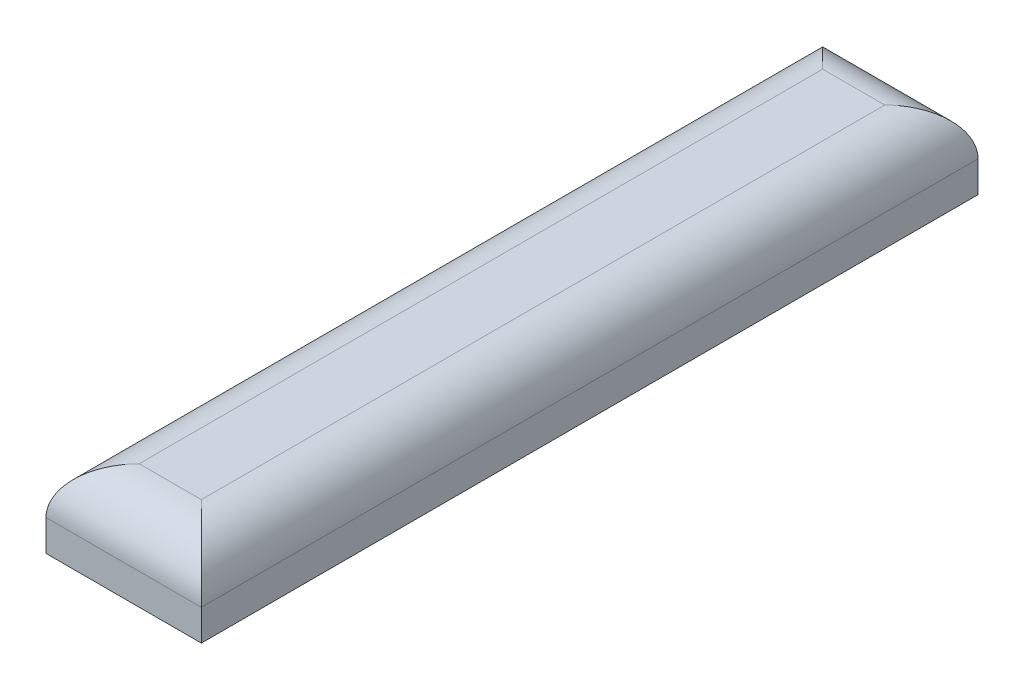
ISO-10303-21;
HEADER;
FILE_DESCRIPTION(('STEP AP214'),'2;1');
FILE_NAME('part.step','',(''),(''),'','','');
FILE_SCHEMA(('AUTOMOTIVE_DESIGN { 1 0 10303 214 1 1 1 1 }'));
ENDSEC;
DATA;
#1=APPLICATION_CONTEXT('core data for automotive mechanical design processes');
#2=APPLICATION_PROTOCOL_DEFINITION('international standard','automotive_design',2000,#1);
#3=PRODUCT_CONTEXT('',#1,'mechanical');
#4=PRODUCT('Part','Part','',(#3));
#5=PRODUCT_RELATED_PRODUCT_CATEGORY('part','',(#4));
#6=PRODUCT_DEFINITION_FORMATION('','',#4);
#7=PRODUCT_DEFINITION_CONTEXT('part definition',#1,'design');
#8=PRODUCT_DEFINITION('design','',#6,#7);
#9=PRODUCT_DEFINITION_SHAPE('','',#8);
#10=(LENGTH_UNIT() NAMED_UNIT(*) SI_UNIT(.MILLI.,.METRE.));
#11=(NAMED_UNIT(*) PLANE_ANGLE_UNIT() SI_UNIT($,.RADIAN.));
#12=(NAMED_UNIT(*) SI_UNIT($,.STERADIAN.) SOLID_ANGLE_UNIT());
#13=UNCERTAINTY_MEASURE_WITH_UNIT(LENGTH_MEASURE(1.E-05),#10,'distance_accuracy_value','');
#14=(GEOMETRIC_REPRESENTATION_CONTEXT(3) GLOBAL_UNCERTAINTY_ASSIGNED_CONTEXT((#13)) GLOBAL_UNIT_ASSIGNED_CONTEXT((#10,
#11,#12)) REPRESENTATION_CONTEXT('',''));
#15=CARTESIAN_POINT('',(0.,0.,0.));
#16=DIRECTION('',(0.,0.,1.));
#17=DIRECTION('',(1.,0.,0.));
#18=AXIS2_PLACEMENT_3D('',#15,#16,#17);
#19=CARTESIAN_POINT('',(12.7,12.7,-63.5));
#20=DIRECTION('',(-1.,0.,0.));
#21=DIRECTION('',(0.,0.,1.));
#22=AXIS2_PLACEMENT_3D('',#19,#20,#21);
#23=PLANE('',#22);
#24=DIRECTION('',(0.,-1.,0.));
#25=VECTOR('',#24,1.);
#26=CARTESIAN_POINT('',(12.7,12.7,-63.5));
#27=LINE('',#26,#25);
#28=CARTESIAN_POINT('',(12.7,5.08,-63.5));
#29=VERTEX_POINT('',#28);
#30=CARTESIAN_POINT('',(12.7,0.,-63.5));
#31=VERTEX_POINT('',#30);
#32=EDGE_CURVE('E89',#29,#31,#27,.T.);
#33=ORIENTED_EDGE('',*,*,#32,.F.);
#34=DIRECTION('',(0.,0.,-1.));
#35=VECTOR('',#34,1.);
#36=CARTESIAN_POINT('',(12.7,5.08,63.5));
#37=LINE('',#36,#35);
#38=CARTESIAN_POINT('',(12.7,5.08,63.5));
#39=VERTEX_POINT('',#38);
#40=EDGE_CURVE('E11',#29,#39,#37,.F.);
#41=ORIENTED_EDGE('',*,*,#40,.T.);
#42=DIRECTION('',(0.,-1.,0.));
#43=VECTOR('',#42,1.);
#44=CARTESIAN_POINT('',(12.7,12.7,63.5));
#45=LINE('',#44,#43);
#46=CARTESIAN_POINT('',(12.7,0.,63.5));
#47=VERTEX_POINT('',#46);
#48=EDGE_CURVE('E109',#39,#47,#45,.T.);
#49=ORIENTED_EDGE('',*,*,#48,.T.);
#50=DIRECTION('',(0.,0.,-1.));
#51=VECTOR('',#50,1.);
#52=CARTESIAN_POINT('',(12.7,0.,-63.5));
#53=LINE('',#52,#51);
#54=EDGE_CURVE('E104',#47,#31,#53,.T.);
#55=ORIENTED_EDGE('',*,*,#54,.T.);
#56=EDGE_LOOP('',(#33,#41,#49,#55));
#57=FACE_BOUND('',#56,.T.);
#58=ADVANCED_FACE('F37',(#57),#23,.F.);
#59=CARTESIAN_POINT('',(-12.7,12.7,-63.5));
#60=DIRECTION('',(0.,0.,1.));
#61=DIRECTION('',(1.,0.,0.));
#62=AXIS2_PLACEMENT_3D('',#59,#60,#61);
#63=PLANE('',#62);
#64=DIRECTION('',(0.,-1.,0.));
#65=VECTOR('',#64,1.);
#66=CARTESIAN_POINT('',(-12.7,12.7,-63.5));
#67=LINE('',#66,#65);
#68=CARTESIAN_POINT('',(-12.7,5.08,-63.5));
#69=VERTEX_POINT('',#68);
#70=CARTESIAN_POINT('',(-12.7,0.,-63.5));
#71=VERTEX_POINT('',#70);
#72=EDGE_CURVE('E98',#69,#71,#67,.T.);
#73=ORIENTED_EDGE('',*,*,#72,.F.);
#74=DIRECTION('',(-1.,0.,0.));
#75=VECTOR('',#74,1.);
#76=CARTESIAN_POINT('',(12.7,5.08,-63.5));
#77=LINE('',#76,#75);
#78=EDGE_CURVE('E46',#69,#29,#77,.F.);
#79=ORIENTED_EDGE('',*,*,#78,.T.);
#80=ORIENTED_EDGE('',*,*,#32,.T.);
#81=DIRECTION('',(-1.,0.,0.));
#82=VECTOR('',#81,1.);
#83=CARTESIAN_POINT('',(-12.7,0.,-63.5));
#84=LINE('',#83,#82);
#85=EDGE_CURVE('E92',#31,#71,#84,.T.);
#86=ORIENTED_EDGE('',*,*,#85,.T.);
#87=EDGE_LOOP('',(#73,#79,#80,#86));
#88=FACE_BOUND('',#87,.T.);
#89=ADVANCED_FACE('F91',(#88),#63,.F.);
#90=CARTESIAN_POINT('',(-12.7,12.7,-63.5));
#91=DIRECTION('',(1.,0.,0.));
#92=DIRECTION('',(0.,0.,-1.));
#93=AXIS2_PLACEMENT_3D('',#90,#91,#92);
#94=PLANE('',#93);
#95=DIRECTION('',(0.,-1.,0.));
#96=VECTOR('',#95,1.);
#97=CARTESIAN_POINT('',(-12.7,12.7,63.5));
#98=LINE('',#97,#96);
#99=CARTESIAN_POINT('',(-12.7,5.08,63.5));
#100=VERTEX_POINT('',#99);
#101=CARTESIAN_POINT('',(-12.7,0.,63.5));
#102=VERTEX_POINT('',#101);
#103=EDGE_CURVE('E119',#100,#102,#98,.T.);
#104=ORIENTED_EDGE('',*,*,#103,.F.);
#105=DIRECTION('',(0.,0.,1.));
#106=VECTOR('',#105,1.);
#107=CARTESIAN_POINT('',(-12.7,5.08,-63.5));
#108=LINE('',#107,#106);
#109=EDGE_CURVE('E61',#100,#69,#108,.F.);
#110=ORIENTED_EDGE('',*,*,#109,.T.);
#111=ORIENTED_EDGE('',*,*,#72,.T.);
#112=DIRECTION('',(0.,0.,1.));
#113=VECTOR('',#112,1.);
#114=CARTESIAN_POINT('',(-12.7,0.,-63.5));
#115=LINE('',#114,#113);
#116=EDGE_CURVE('E106',#71,#102,#115,.T.);
#117=ORIENTED_EDGE('',*,*,#116,.T.);
#118=EDGE_LOOP('',(#104,#110,#111,#117));
#119=FACE_BOUND('',#118,.T.);
#120=ADVANCED_FACE('F157',(#119),#94,.F.);
#121=CARTESIAN_POINT('',(-12.7,12.7,63.5));
#122=DIRECTION('',(0.,0.,-1.));
#123=DIRECTION('',(-1.,0.,0.));
#124=AXIS2_PLACEMENT_3D('',#121,#122,#123);
#125=PLANE('',#124);
#126=ORIENTED_EDGE('',*,*,#48,.F.);
#127=DIRECTION('',(1.,0.,0.));
#128=VECTOR('',#127,1.);
#129=CARTESIAN_POINT('',(-12.7,5.08,63.5));
#130=LINE('',#129,#128);
#131=EDGE_CURVE('E130',#39,#100,#130,.F.);
#132=ORIENTED_EDGE('',*,*,#131,.T.);
#133=ORIENTED_EDGE('',*,*,#103,.T.);
#134=DIRECTION('',(1.,0.,0.));
#135=VECTOR('',#134,1.);
#136=CARTESIAN_POINT('',(-12.7,0.,63.5));
#137=LINE('',#136,#135);
#138=EDGE_CURVE('E116',#102,#47,#137,.T.);
#139=ORIENTED_EDGE('',*,*,#138,.T.);
#140=EDGE_LOOP('',(#126,#132,#133,#139));
#141=FACE_BOUND('',#140,.T.);
#142=ADVANCED_FACE('F156',(#141),#125,.F.);
#143=CARTESIAN_POINT('',(0.,12.7,0.));
#144=DIRECTION('',(0.,1.,0.));
#145=DIRECTION('',(0.,0.,1.));
#146=AXIS2_PLACEMENT_3D('',#143,#144,#145);
#147=PLANE('',#146);
#148=DIRECTION('',(0.,0.,1.));
#149=VECTOR('',#148,1.);
#150=CARTESIAN_POINT('',(-5.08,12.7,63.5));
#151=LINE('',#150,#149);
#152=CARTESIAN_POINT('',(-5.08000000000001,12.7,-55.88));
#153=VERTEX_POINT('',#152);
#154=CARTESIAN_POINT('',(-5.08,12.7,55.88));
#155=VERTEX_POINT('',#154);
#156=EDGE_CURVE('E125',#153,#155,#151,.T.);
#157=ORIENTED_EDGE('',*,*,#156,.T.);
#158=DIRECTION('',(1.,0.,0.));
#159=VECTOR('',#158,1.);
#160=CARTESIAN_POINT('',(12.7,12.7,55.88));
#161=LINE('',#160,#159);
#162=CARTESIAN_POINT('',(5.08,12.7,55.88));
#163=VERTEX_POINT('',#162);
#164=EDGE_CURVE('E127',#155,#163,#161,.T.);
#165=ORIENTED_EDGE('',*,*,#164,.T.);
#166=DIRECTION('',(0.,0.,-1.));
#167=VECTOR('',#166,1.);
#168=CARTESIAN_POINT('',(5.07999999999999,12.7,-63.5));
#169=LINE('',#168,#167);
#170=CARTESIAN_POINT('',(5.07999999999999,12.7,-55.88));
#171=VERTEX_POINT('',#170);
#172=EDGE_CURVE('E97',#163,#171,#169,.T.);
#173=ORIENTED_EDGE('',*,*,#172,.T.);
#174=DIRECTION('',(-1.,0.,0.));
#175=VECTOR('',#174,1.);
#176=CARTESIAN_POINT('',(-12.7,12.7,-55.88));
#177=LINE('',#176,#175);
#178=EDGE_CURVE('E123',#171,#153,#177,.T.);
#179=ORIENTED_EDGE('',*,*,#178,.T.);
#180=EDGE_LOOP('',(#157,#165,#173,#179));
#181=FACE_BOUND('',#180,.T.);
#182=ADVANCED_FACE('F149',(#181),#147,.T.);
#183=CARTESIAN_POINT('',(0.,0.,0.));
#184=DIRECTION('',(0.,1.,0.));
#185=DIRECTION('',(0.,0.,1.));
#186=AXIS2_PLACEMENT_3D('',#183,#184,#185);
#187=PLANE('',#186);
#188=ORIENTED_EDGE('',*,*,#54,.F.);
#189=ORIENTED_EDGE('',*,*,#138,.F.);
#190=ORIENTED_EDGE('',*,*,#116,.F.);
#191=ORIENTED_EDGE('',*,*,#85,.F.);
#192=EDGE_LOOP('',(#188,#189,#190,#191));
#193=FACE_BOUND('',#192,.T.);
#194=ADVANCED_FACE('F102',(#193),#187,.F.);
#195=CARTESIAN_POINT('',(0.,5.08,-55.88));
#196=DIRECTION('',(1.,0.,0.));
#197=DIRECTION('',(0.,0.,-1.));
#198=AXIS2_PLACEMENT_3D('',#195,#196,#197);
#199=CYLINDRICAL_SURFACE('',#198,7.62);
#200=CARTESIAN_POINT('',(5.07999999999999,5.08,-55.88));
#201=DIRECTION('',(0.707106781186547,0.,0.707106781186547));
#202=DIRECTION('',(-0.707106781186547,0.,0.707106781186548));
#203=AXIS2_PLACEMENT_3D('',#200,#201,#202);
#204=ELLIPSE('',#203,10.776307345283,7.62);
#205=EDGE_CURVE('E113',#29,#171,#204,.T.);
#206=ORIENTED_EDGE('',*,*,#205,.F.);
#207=ORIENTED_EDGE('',*,*,#78,.F.);
#208=CARTESIAN_POINT('',(-5.08000000000001,5.08,-55.88));
#209=DIRECTION('',(0.707106781186547,0.,-0.707106781186548));
#210=DIRECTION('',(0.707106781186548,0.,0.707106781186547));
#211=AXIS2_PLACEMENT_3D('',#208,#209,#210);
#212=ELLIPSE('',#211,10.776307345283,7.62);
#213=EDGE_CURVE('E41',#153,#69,#212,.F.);
#214=ORIENTED_EDGE('',*,*,#213,.F.);
#215=ORIENTED_EDGE('',*,*,#178,.F.);
#216=EDGE_LOOP('',(#206,#207,#214,#215));
#217=FACE_BOUND('',#216,.T.);
#218=ADVANCED_FACE('F39',(#217),#199,.T.);
#219=CARTESIAN_POINT('',(-5.08,5.08,0.));
#220=DIRECTION('',(0.,0.,-1.));
#221=DIRECTION('',(-1.,0.,0.));
#222=AXIS2_PLACEMENT_3D('',#219,#220,#221);
#223=CYLINDRICAL_SURFACE('',#222,7.62);
#224=ORIENTED_EDGE('',*,*,#213,.T.);
#225=ORIENTED_EDGE('',*,*,#109,.F.);
#226=CARTESIAN_POINT('',(-5.08,5.08,55.88));
#227=DIRECTION('',(-0.707106781186548,0.,-0.707106781186547));
#228=DIRECTION('',(0.707106781186547,0.,-0.707106781186548));
#229=AXIS2_PLACEMENT_3D('',#226,#227,#228);
#230=ELLIPSE('',#229,10.776307345283,7.62);
#231=EDGE_CURVE('E137',#155,#100,#230,.F.);
#232=ORIENTED_EDGE('',*,*,#231,.F.);
#233=ORIENTED_EDGE('',*,*,#156,.F.);
#234=EDGE_LOOP('',(#224,#225,#232,#233));
#235=FACE_BOUND('',#234,.T.);
#236=ADVANCED_FACE('F174',(#235),#223,.T.);
#237=CARTESIAN_POINT('',(5.07999999999999,5.08,0.));
#238=DIRECTION('',(0.,0.,1.));
#239=DIRECTION('',(1.,0.,0.));
#240=AXIS2_PLACEMENT_3D('',#237,#238,#239);
#241=CYLINDRICAL_SURFACE('',#240,7.62);
#242=ORIENTED_EDGE('',*,*,#205,.T.);
#243=ORIENTED_EDGE('',*,*,#172,.F.);
#244=CARTESIAN_POINT('',(5.08,5.08,55.88));
#245=DIRECTION('',(-0.707106781186547,0.,0.707106781186548));
#246=DIRECTION('',(0.707106781186547,0.,0.707106781186547));
#247=AXIS2_PLACEMENT_3D('',#244,#245,#246);
#248=ELLIPSE('',#247,10.776307345283,7.62);
#249=EDGE_CURVE('E135',#39,#163,#248,.T.);
#250=ORIENTED_EDGE('',*,*,#249,.F.);
#251=ORIENTED_EDGE('',*,*,#40,.F.);
#252=EDGE_LOOP('',(#242,#243,#250,#251));
#253=FACE_BOUND('',#252,.T.);
#254=ADVANCED_FACE('F142',(#253),#241,.T.);
#255=CARTESIAN_POINT('',(0.,5.08,55.88));
#256=DIRECTION('',(-1.,0.,0.));
#257=DIRECTION('',(0.,0.,1.));
#258=AXIS2_PLACEMENT_3D('',#255,#256,#257);
#259=CYLINDRICAL_SURFACE('',#258,7.62);
#260=ORIENTED_EDGE('',*,*,#231,.T.);
#261=ORIENTED_EDGE('',*,*,#131,.F.);
#262=ORIENTED_EDGE('',*,*,#249,.T.);
#263=ORIENTED_EDGE('',*,*,#164,.F.);
#264=EDGE_LOOP('',(#260,#261,#262,#263));
#265=FACE_BOUND('',#264,.T.);
#266=ADVANCED_FACE('F153',(#265),#259,.T.);
#267=CLOSED_SHELL('',(#58,#89,#120,#142,#182,#194,#218,#236,#254,#266));
#268=MANIFOLD_SOLID_BREP('B2',#267);
#269=ADVANCED_BREP_SHAPE_REPRESENTATION('',(#18,#268),#14);
#270=SHAPE_DEFINITION_REPRESENTATION(#9,#269);
ENDSEC;
END-ISO-10303-21;
